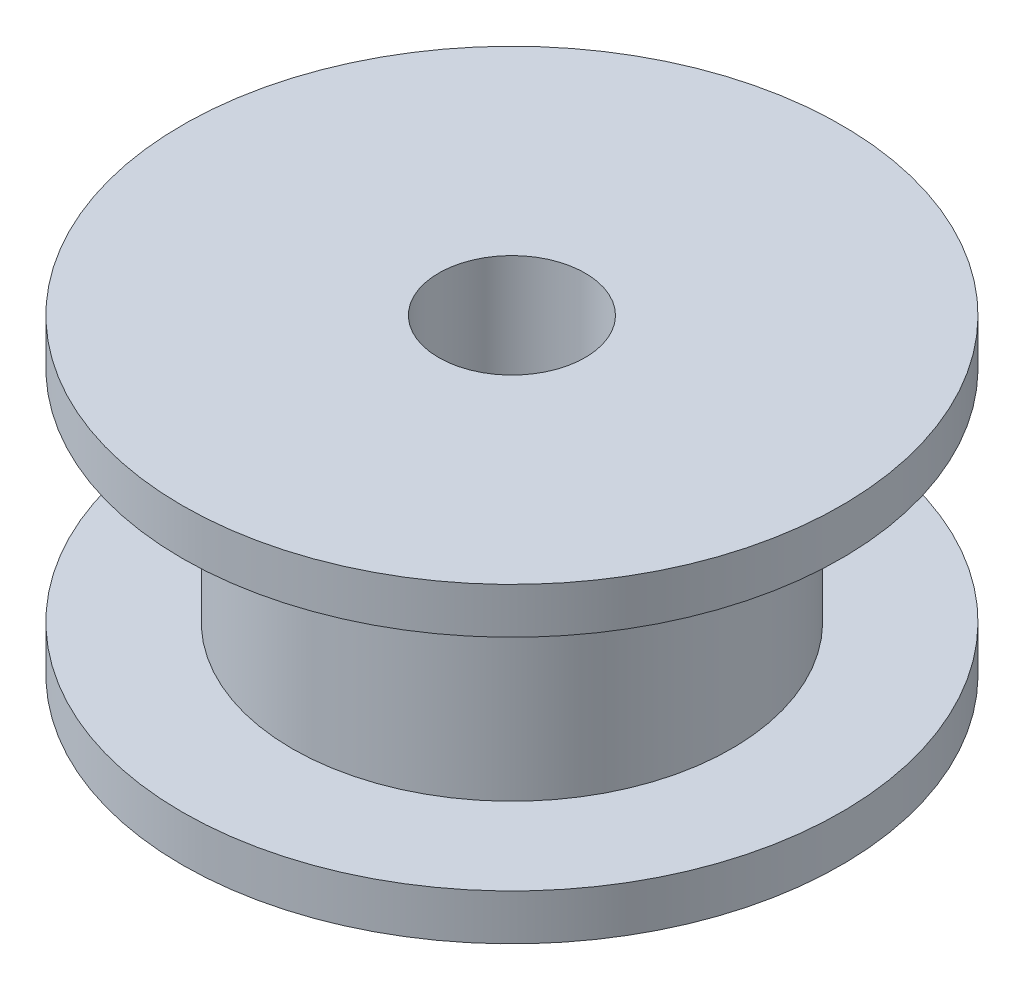
ISO-10303-21;
HEADER;
FILE_DESCRIPTION(('STEP AP214'),'2;1');
FILE_NAME('part.step','',(''),(''),'','','');
FILE_SCHEMA(('AUTOMOTIVE_DESIGN { 1 0 10303 214 1 1 1 1 }'));
ENDSEC;
DATA;
#1=APPLICATION_CONTEXT('core data for automotive mechanical design processes');
#2=APPLICATION_PROTOCOL_DEFINITION('international standard','automotive_design',2000,#1);
#3=PRODUCT_CONTEXT('',#1,'mechanical');
#4=PRODUCT('Part','Part','',(#3));
#5=PRODUCT_RELATED_PRODUCT_CATEGORY('part','',(#4));
#6=PRODUCT_DEFINITION_FORMATION('','',#4);
#7=PRODUCT_DEFINITION_CONTEXT('part definition',#1,'design');
#8=PRODUCT_DEFINITION('design','',#6,#7);
#9=PRODUCT_DEFINITION_SHAPE('','',#8);
#10=(LENGTH_UNIT() NAMED_UNIT(*) SI_UNIT(.MILLI.,.METRE.));
#11=(NAMED_UNIT(*) PLANE_ANGLE_UNIT() SI_UNIT($,.RADIAN.));
#12=(NAMED_UNIT(*) SI_UNIT($,.STERADIAN.) SOLID_ANGLE_UNIT());
#13=UNCERTAINTY_MEASURE_WITH_UNIT(LENGTH_MEASURE(1.E-05),#10,'distance_accuracy_value','');
#14=(GEOMETRIC_REPRESENTATION_CONTEXT(3) GLOBAL_UNCERTAINTY_ASSIGNED_CONTEXT((#13)) GLOBAL_UNIT_ASSIGNED_CONTEXT((#10,
#11,#12)) REPRESENTATION_CONTEXT('',''));
#15=CARTESIAN_POINT('',(0.,0.,0.));
#16=DIRECTION('',(0.,0.,1.));
#17=DIRECTION('',(1.,0.,0.));
#18=AXIS2_PLACEMENT_3D('',#15,#16,#17);
#19=CARTESIAN_POINT('',(0.,1.25,0.));
#20=DIRECTION('',(0.,-1.,0.));
#21=DIRECTION('',(0.,0.,-1.));
#22=AXIS2_PLACEMENT_3D('',#19,#20,#21);
#23=CYLINDRICAL_SURFACE('',#22,9.);
#24=CARTESIAN_POINT('',(0.,1.25,0.));
#25=DIRECTION('',(0.,1.,0.));
#26=DIRECTION('',(0.,0.,1.));
#27=AXIS2_PLACEMENT_3D('',#24,#25,#26);
#28=CIRCLE('',#27,9.);
#29=CARTESIAN_POINT('',(0.,1.25,9.));
#30=VERTEX_POINT('',#29);
#31=EDGE_CURVE('E38',#30,#30,#28,.T.);
#32=ORIENTED_EDGE('',*,*,#31,.F.);
#33=EDGE_LOOP('',(#32));
#34=FACE_BOUND('',#33,.T.);
#35=CARTESIAN_POINT('',(0.,0.,0.));
#36=DIRECTION('',(0.,1.,0.));
#37=DIRECTION('',(0.,0.,1.));
#38=AXIS2_PLACEMENT_3D('',#35,#36,#37);
#39=CIRCLE('',#38,9.);
#40=CARTESIAN_POINT('',(0.,0.,9.));
#41=VERTEX_POINT('',#40);
#42=EDGE_CURVE('E34',#41,#41,#39,.T.);
#43=ORIENTED_EDGE('',*,*,#42,.T.);
#44=EDGE_LOOP('',(#43));
#45=FACE_BOUND('',#44,.T.);
#46=ADVANCED_FACE('F31',(#34,#45),#23,.T.);
#47=CARTESIAN_POINT('',(0.,1.25,0.));
#48=DIRECTION('',(0.,1.,0.));
#49=DIRECTION('',(0.,0.,1.));
#50=AXIS2_PLACEMENT_3D('',#47,#48,#49);
#51=PLANE('',#50);
#52=CARTESIAN_POINT('',(0.,1.25,0.));
#53=DIRECTION('',(0.,1.,0.));
#54=DIRECTION('',(0.,0.,1.));
#55=AXIS2_PLACEMENT_3D('',#52,#53,#54);
#56=CIRCLE('',#55,6.);
#57=CARTESIAN_POINT('',(0.,1.25,6.));
#58=VERTEX_POINT('',#57);
#59=EDGE_CURVE('E10',#58,#58,#56,.T.);
#60=ORIENTED_EDGE('',*,*,#59,.F.);
#61=EDGE_LOOP('',(#60));
#62=FACE_BOUND('',#61,.T.);
#63=ORIENTED_EDGE('',*,*,#31,.T.);
#64=EDGE_LOOP('',(#63));
#65=FACE_BOUND('',#64,.T.);
#66=ADVANCED_FACE('F85',(#62,#65),#51,.T.);
#67=CARTESIAN_POINT('',(0.,0.,0.));
#68=DIRECTION('',(0.,1.,0.));
#69=DIRECTION('',(0.,0.,1.));
#70=AXIS2_PLACEMENT_3D('',#67,#68,#69);
#71=PLANE('',#70);
#72=CARTESIAN_POINT('',(0.,0.,0.));
#73=DIRECTION('',(0.,1.,0.));
#74=DIRECTION('',(0.,0.,1.));
#75=AXIS2_PLACEMENT_3D('',#72,#73,#74);
#76=CIRCLE('',#75,2.);
#77=CARTESIAN_POINT('',(0.,0.,2.));
#78=VERTEX_POINT('',#77);
#79=EDGE_CURVE('E51',#78,#78,#76,.T.);
#80=ORIENTED_EDGE('',*,*,#79,.T.);
#81=EDGE_LOOP('',(#80));
#82=FACE_BOUND('',#81,.T.);
#83=ORIENTED_EDGE('',*,*,#42,.F.);
#84=EDGE_LOOP('',(#83));
#85=FACE_BOUND('',#84,.T.);
#86=ADVANCED_FACE('F90',(#82,#85),#71,.F.);
#87=CARTESIAN_POINT('',(0.,7.25,0.));
#88=DIRECTION('',(0.,-1.,0.));
#89=DIRECTION('',(0.,0.,-1.));
#90=AXIS2_PLACEMENT_3D('',#87,#88,#89);
#91=CYLINDRICAL_SURFACE('',#90,6.);
#92=CARTESIAN_POINT('',(0.,7.25,0.));
#93=DIRECTION('',(0.,1.,0.));
#94=DIRECTION('',(0.,0.,1.));
#95=AXIS2_PLACEMENT_3D('',#92,#93,#94);
#96=CIRCLE('',#95,6.);
#97=CARTESIAN_POINT('',(0.,7.25,6.));
#98=VERTEX_POINT('',#97);
#99=EDGE_CURVE('E44',#98,#98,#96,.T.);
#100=ORIENTED_EDGE('',*,*,#99,.F.);
#101=EDGE_LOOP('',(#100));
#102=FACE_BOUND('',#101,.T.);
#103=ORIENTED_EDGE('',*,*,#59,.T.);
#104=EDGE_LOOP('',(#103));
#105=FACE_BOUND('',#104,.T.);
#106=ADVANCED_FACE('F73',(#102,#105),#91,.T.);
#107=CARTESIAN_POINT('',(0.,8.5,0.));
#108=DIRECTION('',(0.,-1.,0.));
#109=DIRECTION('',(0.,0.,-1.));
#110=AXIS2_PLACEMENT_3D('',#107,#108,#109);
#111=CYLINDRICAL_SURFACE('',#110,9.);
#112=CARTESIAN_POINT('',(0.,8.5,0.));
#113=DIRECTION('',(0.,1.,0.));
#114=DIRECTION('',(0.,0.,1.));
#115=AXIS2_PLACEMENT_3D('',#112,#113,#114);
#116=CIRCLE('',#115,9.);
#117=CARTESIAN_POINT('',(0.,8.5,9.));
#118=VERTEX_POINT('',#117);
#119=EDGE_CURVE('E47',#118,#118,#116,.T.);
#120=ORIENTED_EDGE('',*,*,#119,.F.);
#121=EDGE_LOOP('',(#120));
#122=FACE_BOUND('',#121,.T.);
#123=CARTESIAN_POINT('',(0.,7.25,0.));
#124=DIRECTION('',(0.,1.,0.));
#125=DIRECTION('',(0.,0.,1.));
#126=AXIS2_PLACEMENT_3D('',#123,#124,#125);
#127=CIRCLE('',#126,9.);
#128=CARTESIAN_POINT('',(0.,7.25,9.));
#129=VERTEX_POINT('',#128);
#130=EDGE_CURVE('E48',#129,#129,#127,.T.);
#131=ORIENTED_EDGE('',*,*,#130,.T.);
#132=EDGE_LOOP('',(#131));
#133=FACE_BOUND('',#132,.T.);
#134=ADVANCED_FACE('F67',(#122,#133),#111,.T.);
#135=CARTESIAN_POINT('',(0.,8.5,0.));
#136=DIRECTION('',(0.,1.,0.));
#137=DIRECTION('',(0.,0.,1.));
#138=AXIS2_PLACEMENT_3D('',#135,#136,#137);
#139=PLANE('',#138);
#140=CARTESIAN_POINT('',(0.,8.5,0.));
#141=DIRECTION('',(0.,1.,0.));
#142=DIRECTION('',(0.,0.,1.));
#143=AXIS2_PLACEMENT_3D('',#140,#141,#142);
#144=CIRCLE('',#143,2.);
#145=CARTESIAN_POINT('',(0.,8.5,2.));
#146=VERTEX_POINT('',#145);
#147=EDGE_CURVE('E56',#146,#146,#144,.T.);
#148=ORIENTED_EDGE('',*,*,#147,.F.);
#149=EDGE_LOOP('',(#148));
#150=FACE_BOUND('',#149,.T.);
#151=ORIENTED_EDGE('',*,*,#119,.T.);
#152=EDGE_LOOP('',(#151));
#153=FACE_BOUND('',#152,.T.);
#154=ADVANCED_FACE('F63',(#150,#153),#139,.T.);
#155=CARTESIAN_POINT('',(0.,7.25,0.));
#156=DIRECTION('',(0.,1.,0.));
#157=DIRECTION('',(0.,0.,1.));
#158=AXIS2_PLACEMENT_3D('',#155,#156,#157);
#159=PLANE('',#158);
#160=ORIENTED_EDGE('',*,*,#99,.T.);
#161=EDGE_LOOP('',(#160));
#162=FACE_BOUND('',#161,.T.);
#163=ORIENTED_EDGE('',*,*,#130,.F.);
#164=EDGE_LOOP('',(#163));
#165=FACE_BOUND('',#164,.T.);
#166=ADVANCED_FACE('F66',(#162,#165),#159,.F.);
#167=CARTESIAN_POINT('',(0.,-1.75,0.));
#168=DIRECTION('',(0.,1.,0.));
#169=DIRECTION('',(0.,0.,1.));
#170=AXIS2_PLACEMENT_3D('',#167,#168,#169);
#171=CYLINDRICAL_SURFACE('',#170,2.);
#172=CARTESIAN_POINT('',(0.,8.5,2.));
#173=CARTESIAN_POINT('',(0.,8.41145833333333,2.));
#174=CARTESIAN_POINT('',(0.,8.32291666666667,2.));
#175=CARTESIAN_POINT('',(0.,8.14583333333333,2.));
#176=CARTESIAN_POINT('',(0.,8.05729166666667,2.));
#177=CARTESIAN_POINT('',(0.,7.88020833333333,2.));
#178=CARTESIAN_POINT('',(0.,7.79166666666666,2.));
#179=CARTESIAN_POINT('',(0.,7.61458333333333,2.));
#180=CARTESIAN_POINT('',(0.,7.52604166666666,2.));
#181=CARTESIAN_POINT('',(0.,7.34895833333333,2.));
#182=CARTESIAN_POINT('',(0.,7.26041666666667,2.));
#183=CARTESIAN_POINT('',(0.,7.08333333333333,2.));
#184=CARTESIAN_POINT('',(0.,6.99479166666667,2.));
#185=CARTESIAN_POINT('',(0.,6.81770833333333,2.));
#186=CARTESIAN_POINT('',(0.,6.72916666666667,2.));
#187=CARTESIAN_POINT('',(0.,6.55208333333333,2.));
#188=CARTESIAN_POINT('',(0.,6.46354166666667,2.));
#189=CARTESIAN_POINT('',(0.,6.28645833333333,2.));
#190=CARTESIAN_POINT('',(0.,6.19791666666667,2.));
#191=CARTESIAN_POINT('',(0.,6.02083333333333,2.));
#192=CARTESIAN_POINT('',(0.,5.93229166666667,2.));
#193=CARTESIAN_POINT('',(0.,5.75520833333333,2.));
#194=CARTESIAN_POINT('',(0.,5.66666666666667,2.));
#195=CARTESIAN_POINT('',(0.,5.48958333333333,2.));
#196=CARTESIAN_POINT('',(0.,5.40104166666667,2.));
#197=CARTESIAN_POINT('',(0.,5.22395833333333,2.));
#198=CARTESIAN_POINT('',(0.,5.13541666666667,2.));
#199=CARTESIAN_POINT('',(0.,4.95833333333333,2.));
#200=CARTESIAN_POINT('',(0.,4.86979166666667,2.));
#201=CARTESIAN_POINT('',(0.,4.69270833333333,2.));
#202=CARTESIAN_POINT('',(0.,4.60416666666667,2.));
#203=CARTESIAN_POINT('',(0.,4.42708333333333,2.));
#204=CARTESIAN_POINT('',(0.,4.33854166666667,2.));
#205=CARTESIAN_POINT('',(0.,4.16145833333333,2.));
#206=CARTESIAN_POINT('',(0.,4.07291666666667,2.));
#207=CARTESIAN_POINT('',(0.,3.89583333333333,2.));
#208=CARTESIAN_POINT('',(0.,3.80729166666667,2.));
#209=CARTESIAN_POINT('',(0.,3.63020833333333,2.));
#210=CARTESIAN_POINT('',(0.,3.54166666666667,2.));
#211=CARTESIAN_POINT('',(0.,3.36458333333333,2.));
#212=CARTESIAN_POINT('',(0.,3.27604166666667,2.));
#213=CARTESIAN_POINT('',(0.,3.09895833333333,2.));
#214=CARTESIAN_POINT('',(0.,3.01041666666667,2.));
#215=CARTESIAN_POINT('',(0.,2.83333333333333,2.));
#216=CARTESIAN_POINT('',(0.,2.74479166666667,2.));
#217=CARTESIAN_POINT('',(0.,2.56770833333333,2.));
#218=CARTESIAN_POINT('',(0.,2.47916666666667,2.));
#219=CARTESIAN_POINT('',(0.,2.30208333333333,2.));
#220=CARTESIAN_POINT('',(0.,2.21354166666667,2.));
#221=CARTESIAN_POINT('',(0.,2.03645833333333,2.));
#222=CARTESIAN_POINT('',(0.,1.94791666666667,2.));
#223=CARTESIAN_POINT('',(0.,1.77083333333333,2.));
#224=CARTESIAN_POINT('',(0.,1.68229166666667,2.));
#225=CARTESIAN_POINT('',(0.,1.50520833333333,2.));
#226=CARTESIAN_POINT('',(0.,1.41666666666667,2.));
#227=CARTESIAN_POINT('',(0.,1.23958333333333,2.));
#228=CARTESIAN_POINT('',(0.,1.15104166666667,2.));
#229=CARTESIAN_POINT('',(0.,0.973958333333333,2.));
#230=CARTESIAN_POINT('',(0.,0.885416666666666,2.));
#231=CARTESIAN_POINT('',(0.,0.708333333333333,2.));
#232=CARTESIAN_POINT('',(0.,0.619791666666667,2.));
#233=CARTESIAN_POINT('',(0.,0.442708333333333,2.));
#234=CARTESIAN_POINT('',(0.,0.354166666666667,2.));
#235=CARTESIAN_POINT('',(0.,0.177083333333333,2.));
#236=CARTESIAN_POINT('',(0.,0.0885416666666664,2.));
#237=CARTESIAN_POINT('',(0.,0.,2.));
#238=B_SPLINE_CURVE_WITH_KNOTS('',3,(#172,#173,#174,#175,#176,#177,#178,#179,#180,#181,#182,
#183,#184,#185,#186,#187,#188,#189,#190,#191,#192,#193,#194,#195,#196,#197,#198,#199,#200,#201,
#202,#203,#204,#205,#206,#207,#208,#209,#210,#211,#212,#213,#214,#215,#216,#217,#218,#219,#220,
#221,#222,#223,#224,#225,#226,#227,#228,#229,#230,#231,#232,#233,#234,#235,#236,#237),
.UNSPECIFIED.,.F.,.F.,(4,2,2,2,2,2,2,2,2,2,2,2,2,2,2,2,2,2,2,2,2,2,2,2,2,2,2,2,2,2,2,2,4),(0.,
0.265625,0.53125,0.796875000000001,1.0625,1.328125,1.59375,1.859375,2.125,2.390625,2.65625,
2.921875,3.1875,3.453125,3.71875,3.984375,4.25,4.515625,4.78125,5.046875,5.3125,5.578125,
5.84375,6.109375,6.375,6.640625,6.90625,7.171875,7.4375,7.703125,7.96875,8.234375,8.5),.UNSPECIFIED.);
#239=EDGE_CURVE('BSEAM60',#146,#78,#238,.T.);
#240=ORIENTED_EDGE('',*,*,#147,.T.);
#241=ORIENTED_EDGE('',*,*,#79,.F.);
#242=ORIENTED_EDGE('',*,*,#239,.T.);
#243=ORIENTED_EDGE('',*,*,#239,.F.);
#244=EDGE_LOOP('',(#240,#242,#241,#243));
#245=FACE_BOUND('',#244,.T.);
#246=ADVANCED_FACE('F60',(#245),#171,.F.);
#247=CLOSED_SHELL('',(#46,#66,#86,#106,#134,#154,#166,#246));
#248=MANIFOLD_SOLID_BREP('B2',#247);
#249=ADVANCED_BREP_SHAPE_REPRESENTATION('',(#18,#248),#14);
#250=SHAPE_DEFINITION_REPRESENTATION(#9,#249);
ENDSEC;
END-ISO-10303-21;
